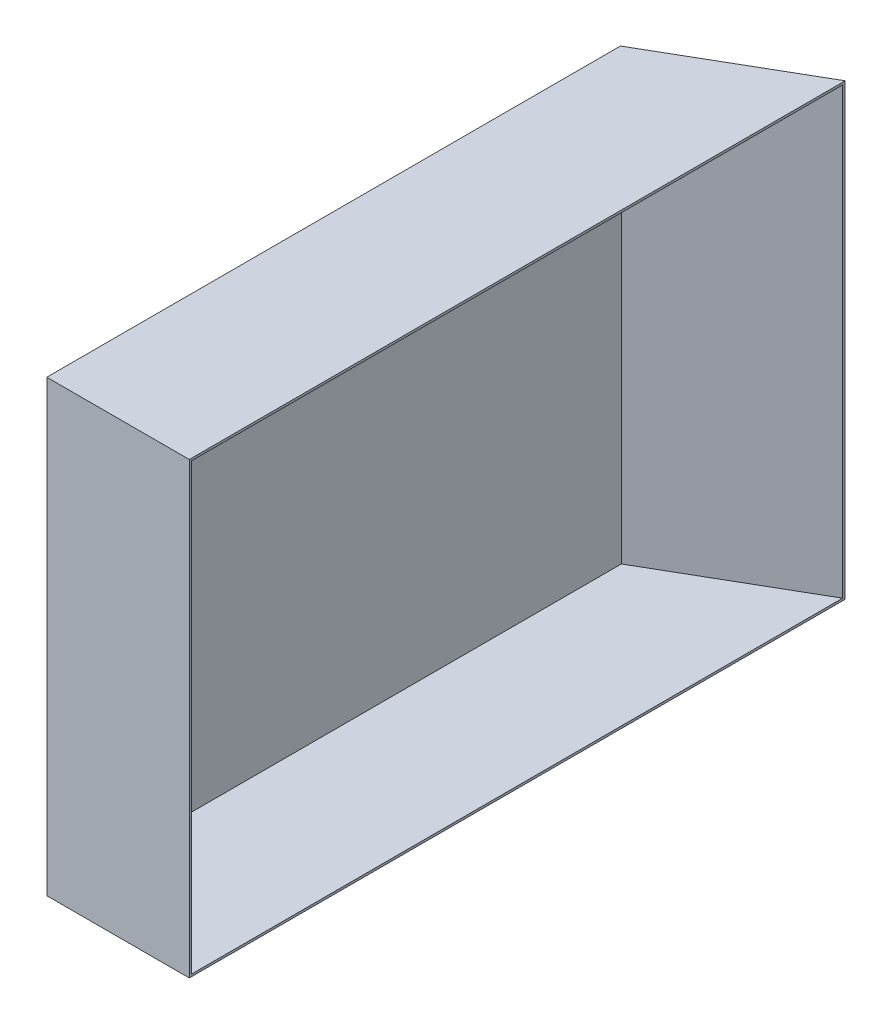
ISO-10303-21;
HEADER;
FILE_DESCRIPTION(('STEP AP214'),'2;1');
FILE_NAME('part.step','',(''),(''),'','','');
FILE_SCHEMA(('AUTOMOTIVE_DESIGN { 1 0 10303 214 1 1 1 1 }'));
ENDSEC;
DATA;
#1=APPLICATION_CONTEXT('core data for automotive mechanical design processes');
#2=APPLICATION_PROTOCOL_DEFINITION('international standard','automotive_design',2000,#1);
#3=PRODUCT_CONTEXT('',#1,'mechanical');
#4=PRODUCT('Part','Part','',(#3));
#5=PRODUCT_RELATED_PRODUCT_CATEGORY('part','',(#4));
#6=PRODUCT_DEFINITION_FORMATION('','',#4);
#7=PRODUCT_DEFINITION_CONTEXT('part definition',#1,'design');
#8=PRODUCT_DEFINITION('design','',#6,#7);
#9=PRODUCT_DEFINITION_SHAPE('','',#8);
#10=(LENGTH_UNIT() NAMED_UNIT(*) SI_UNIT(.MILLI.,.METRE.));
#11=(NAMED_UNIT(*) PLANE_ANGLE_UNIT() SI_UNIT($,.RADIAN.));
#12=(NAMED_UNIT(*) SI_UNIT($,.STERADIAN.) SOLID_ANGLE_UNIT());
#13=UNCERTAINTY_MEASURE_WITH_UNIT(LENGTH_MEASURE(1.E-05),#10,'distance_accuracy_value','');
#14=(GEOMETRIC_REPRESENTATION_CONTEXT(3) GLOBAL_UNCERTAINTY_ASSIGNED_CONTEXT((#13)) GLOBAL_UNIT_ASSIGNED_CONTEXT((#10,
#11,#12)) REPRESENTATION_CONTEXT('',''));
#15=CARTESIAN_POINT('',(0.,0.,0.));
#16=DIRECTION('',(0.,0.,1.));
#17=DIRECTION('',(1.,0.,0.));
#18=AXIS2_PLACEMENT_3D('',#15,#16,#17);
#19=CARTESIAN_POINT('',(196.776289052867,-246.000000000025,-227.031674572562));
#20=DIRECTION('',(1.,0.,0.));
#21=DIRECTION('',(0.,0.,-1.));
#22=AXIS2_PLACEMENT_3D('',#19,#20,#21);
#23=PLANE('',#22);
#24=DIRECTION('',(0.,0.,-1.));
#25=VECTOR('',#24,1.);
#26=CARTESIAN_POINT('',(196.776289052867,253.999999999975,-227.031674572546));
#27=LINE('',#26,#25);
#28=CARTESIAN_POINT('',(196.776289052867,253.999999999952,503.309343176868));
#29=VERTEX_POINT('',#28);
#30=CARTESIAN_POINT('',(196.776289052867,253.999999999975,-227.031674572546));
#31=VERTEX_POINT('',#30);
#32=EDGE_CURVE('E144',#29,#31,#27,.T.);
#33=ORIENTED_EDGE('',*,*,#32,.F.);
#34=DIRECTION('',(0.,1.,0.));
#35=VECTOR('',#34,1.);
#36=CARTESIAN_POINT('',(196.776289052867,-246.000000000048,503.309343176853));
#37=LINE('',#36,#35);
#38=CARTESIAN_POINT('',(196.776289052867,-246.000000000048,503.309343176853));
#39=VERTEX_POINT('',#38);
#40=EDGE_CURVE('E11',#39,#29,#37,.T.);
#41=ORIENTED_EDGE('',*,*,#40,.F.);
#42=DIRECTION('',(0.,0.,-1.));
#43=VECTOR('',#42,1.);
#44=CARTESIAN_POINT('',(196.776289052867,-246.000000000025,-227.031674572562));
#45=LINE('',#44,#43);
#46=CARTESIAN_POINT('',(196.776289052867,-246.000000000025,-227.031674572562));
#47=VERTEX_POINT('',#46);
#48=EDGE_CURVE('E148',#39,#47,#45,.T.);
#49=ORIENTED_EDGE('',*,*,#48,.T.);
#50=DIRECTION('',(0.,1.,0.));
#51=VECTOR('',#50,1.);
#52=CARTESIAN_POINT('',(196.776289052867,-246.000000000025,-227.031674572562));
#53=LINE('',#52,#51);
#54=EDGE_CURVE('E40',#47,#31,#53,.T.);
#55=ORIENTED_EDGE('',*,*,#54,.T.);
#56=EDGE_LOOP('',(#33,#41,#49,#55));
#57=FACE_BOUND('',#56,.T.);
#58=DIRECTION('',(0.,1.,0.));
#59=VECTOR('',#58,1.);
#60=CARTESIAN_POINT('',(196.776289052867,-246.000000000048,500.769343176853));
#61=LINE('',#60,#59);
#62=CARTESIAN_POINT('',(196.776289052867,-243.460000000048,500.769343176853));
#63=VERTEX_POINT('',#62);
#64=CARTESIAN_POINT('',(196.776289052867,251.459999999952,500.769343176868));
#65=VERTEX_POINT('',#64);
#66=EDGE_CURVE('E121',#63,#65,#61,.T.);
#67=ORIENTED_EDGE('',*,*,#66,.T.);
#68=DIRECTION('',(0.,0.,-1.));
#69=VECTOR('',#68,1.);
#70=CARTESIAN_POINT('',(196.776289052867,251.459999999975,-227.031674572547));
#71=LINE('',#70,#69);
#72=CARTESIAN_POINT('',(196.776289052867,251.459999999974,-224.098735205063));
#73=VERTEX_POINT('',#72);
#74=EDGE_CURVE('E141',#65,#73,#71,.T.);
#75=ORIENTED_EDGE('',*,*,#74,.T.);
#76=DIRECTION('',(0.,1.,0.));
#77=VECTOR('',#76,1.);
#78=CARTESIAN_POINT('',(196.776289052867,-246.000000000026,-224.098735205078));
#79=LINE('',#78,#77);
#80=CARTESIAN_POINT('',(196.776289052867,-243.460000000026,-224.098735205078));
#81=VERTEX_POINT('',#80);
#82=EDGE_CURVE('E130',#81,#73,#79,.T.);
#83=ORIENTED_EDGE('',*,*,#82,.F.);
#84=DIRECTION('',(0.,0.,-1.));
#85=VECTOR('',#84,1.);
#86=CARTESIAN_POINT('',(196.776289052867,-243.460000000026,-227.031674572562));
#87=LINE('',#86,#85);
#88=EDGE_CURVE('E53',#63,#81,#87,.T.);
#89=ORIENTED_EDGE('',*,*,#88,.F.);
#90=EDGE_LOOP('',(#67,#75,#83,#89));
#91=FACE_BOUND('',#90,.T.);
#92=ADVANCED_FACE('F37',(#57,#91),#23,.T.);
#93=CARTESIAN_POINT('',(196.776289052867,-246.000000000048,503.309343176853));
#94=DIRECTION('',(0.,0.,1.));
#95=DIRECTION('',(0.,-1.,0.));
#96=AXIS2_PLACEMENT_3D('',#93,#94,#95);
#97=PLANE('',#96);
#98=DIRECTION('',(1.,0.,0.));
#99=VECTOR('',#98,1.);
#100=CARTESIAN_POINT('',(196.776289052867,253.999999999952,503.309343176868));
#101=LINE('',#100,#99);
#102=CARTESIAN_POINT('',(38.1000000000001,253.999999999952,503.309343176868));
#103=VERTEX_POINT('',#102);
#104=EDGE_CURVE('E151',#103,#29,#101,.T.);
#105=ORIENTED_EDGE('',*,*,#104,.F.);
#106=DIRECTION('',(0.,1.,0.));
#107=VECTOR('',#106,1.);
#108=CARTESIAN_POINT('',(38.1000000000001,-246.000000000048,503.309343176853));
#109=LINE('',#108,#107);
#110=CARTESIAN_POINT('',(38.1000000000001,-246.000000000048,503.309343176853));
#111=VERTEX_POINT('',#110);
#112=EDGE_CURVE('E45',#111,#103,#109,.T.);
#113=ORIENTED_EDGE('',*,*,#112,.F.);
#114=DIRECTION('',(1.,0.,0.));
#115=VECTOR('',#114,1.);
#116=CARTESIAN_POINT('',(196.776289052867,-246.000000000048,503.309343176853));
#117=LINE('',#116,#115);
#118=EDGE_CURVE('E156',#111,#39,#117,.T.);
#119=ORIENTED_EDGE('',*,*,#118,.T.);
#120=ORIENTED_EDGE('',*,*,#40,.T.);
#121=EDGE_LOOP('',(#105,#113,#119,#120));
#122=FACE_BOUND('',#121,.T.);
#123=ADVANCED_FACE('F174',(#122),#97,.T.);
#124=CARTESIAN_POINT('',(38.1,-246.000000000028,-135.419876373879));
#125=DIRECTION('',(-1.,0.,0.));
#126=DIRECTION('',(0.,0.,1.));
#127=AXIS2_PLACEMENT_3D('',#124,#125,#126);
#128=PLANE('',#127);
#129=DIRECTION('',(0.,0.,1.));
#130=VECTOR('',#129,1.);
#131=CARTESIAN_POINT('',(38.1,253.999999999972,-135.419876373864));
#132=LINE('',#131,#130);
#133=CARTESIAN_POINT('',(38.1,253.999999999972,-135.419876373864));
#134=VERTEX_POINT('',#133);
#135=EDGE_CURVE('E163',#134,#103,#132,.T.);
#136=ORIENTED_EDGE('',*,*,#135,.F.);
#137=DIRECTION('',(0.,1.,0.));
#138=VECTOR('',#137,1.);
#139=CARTESIAN_POINT('',(38.1,-246.000000000028,-135.419876373879));
#140=LINE('',#139,#138);
#141=CARTESIAN_POINT('',(38.1,-246.000000000028,-135.419876373879));
#142=VERTEX_POINT('',#141);
#143=EDGE_CURVE('E168',#142,#134,#140,.T.);
#144=ORIENTED_EDGE('',*,*,#143,.F.);
#145=DIRECTION('',(0.,0.,1.));
#146=VECTOR('',#145,1.);
#147=CARTESIAN_POINT('',(38.1,-246.000000000028,-135.419876373879));
#148=LINE('',#147,#146);
#149=EDGE_CURVE('E153',#142,#111,#148,.T.);
#150=ORIENTED_EDGE('',*,*,#149,.T.);
#151=ORIENTED_EDGE('',*,*,#112,.T.);
#152=EDGE_LOOP('',(#136,#144,#150,#151));
#153=FACE_BOUND('',#152,.T.);
#154=ADVANCED_FACE('F178',(#153),#128,.T.);
#155=CARTESIAN_POINT('',(196.776289052867,-246.000000000025,-227.031674572562));
#156=DIRECTION('',(-0.499999999999998,0.,-0.86602540378444));
#157=DIRECTION('',(-0.86602540378444,0.,0.499999999999998));
#158=AXIS2_PLACEMENT_3D('',#155,#156,#157);
#159=PLANE('',#158);
#160=DIRECTION('',(-0.86602540378444,0.,0.499999999999998));
#161=VECTOR('',#160,1.);
#162=CARTESIAN_POINT('',(196.776289052867,253.999999999975,-227.031674572546));
#163=LINE('',#162,#161);
#164=EDGE_CURVE('E160',#31,#134,#163,.T.);
#165=ORIENTED_EDGE('',*,*,#164,.F.);
#166=ORIENTED_EDGE('',*,*,#54,.F.);
#167=DIRECTION('',(-0.86602540378444,0.,0.499999999999998));
#168=VECTOR('',#167,1.);
#169=CARTESIAN_POINT('',(196.776289052867,-246.000000000025,-227.031674572562));
#170=LINE('',#169,#168);
#171=EDGE_CURVE('E150',#47,#142,#170,.T.);
#172=ORIENTED_EDGE('',*,*,#171,.T.);
#173=ORIENTED_EDGE('',*,*,#143,.T.);
#174=EDGE_LOOP('',(#165,#166,#172,#173));
#175=FACE_BOUND('',#174,.T.);
#176=ADVANCED_FACE('F171',(#175),#159,.T.);
#177=CARTESIAN_POINT('',(0.,-246.000000000032,-7.49617709115698E-12));
#178=DIRECTION('',(0.,-1.,0.));
#179=DIRECTION('',(0.,0.,-1.));
#180=AXIS2_PLACEMENT_3D('',#177,#178,#179);
#181=PLANE('',#180);
#182=ORIENTED_EDGE('',*,*,#48,.F.);
#183=ORIENTED_EDGE('',*,*,#118,.F.);
#184=ORIENTED_EDGE('',*,*,#149,.F.);
#185=ORIENTED_EDGE('',*,*,#171,.F.);
#186=EDGE_LOOP('',(#182,#183,#184,#185));
#187=FACE_BOUND('',#186,.T.);
#188=ADVANCED_FACE('F180',(#187),#181,.T.);
#189=CARTESIAN_POINT('',(0.,253.999999999968,7.74163392182329E-12));
#190=DIRECTION('',(0.,-1.,0.));
#191=DIRECTION('',(0.,0.,-1.));
#192=AXIS2_PLACEMENT_3D('',#189,#190,#191);
#193=PLANE('',#192);
#194=ORIENTED_EDGE('',*,*,#32,.T.);
#195=ORIENTED_EDGE('',*,*,#164,.T.);
#196=ORIENTED_EDGE('',*,*,#135,.T.);
#197=ORIENTED_EDGE('',*,*,#104,.T.);
#198=EDGE_LOOP('',(#194,#195,#196,#197));
#199=FACE_BOUND('',#198,.T.);
#200=ADVANCED_FACE('F173',(#199),#193,.F.);
#201=CARTESIAN_POINT('',(196.776289052867,-246.000000000048,500.769343176853));
#202=DIRECTION('',(0.,0.,1.));
#203=DIRECTION('',(0.,-1.,0.));
#204=AXIS2_PLACEMENT_3D('',#201,#202,#203);
#205=PLANE('',#204);
#206=DIRECTION('',(1.,0.,0.));
#207=VECTOR('',#206,1.);
#208=CARTESIAN_POINT('',(196.776289052867,251.459999999952,500.769343176868));
#209=LINE('',#208,#207);
#210=CARTESIAN_POINT('',(40.6400000000001,251.459999999952,500.769343176868));
#211=VERTEX_POINT('',#210);
#212=EDGE_CURVE('E136',#211,#65,#209,.T.);
#213=ORIENTED_EDGE('',*,*,#212,.T.);
#214=ORIENTED_EDGE('',*,*,#66,.F.);
#215=DIRECTION('',(1.,0.,0.));
#216=VECTOR('',#215,1.);
#217=CARTESIAN_POINT('',(196.776289052867,-243.460000000048,500.769343176853));
#218=LINE('',#217,#216);
#219=CARTESIAN_POINT('',(40.6400000000001,-243.460000000048,500.769343176853));
#220=VERTEX_POINT('',#219);
#221=EDGE_CURVE('E125',#220,#63,#218,.T.);
#222=ORIENTED_EDGE('',*,*,#221,.F.);
#223=DIRECTION('',(0.,1.,0.));
#224=VECTOR('',#223,1.);
#225=CARTESIAN_POINT('',(40.6400000000001,-246.000000000048,500.769343176853));
#226=LINE('',#225,#224);
#227=EDGE_CURVE('E111',#220,#211,#226,.T.);
#228=ORIENTED_EDGE('',*,*,#227,.T.);
#229=EDGE_LOOP('',(#213,#214,#222,#228));
#230=FACE_BOUND('',#229,.T.);
#231=ADVANCED_FACE('F128',(#230),#205,.F.);
#232=CARTESIAN_POINT('',(40.64,-246.000000000028,-135.419876373879));
#233=DIRECTION('',(-1.,0.,0.));
#234=DIRECTION('',(0.,0.,1.));
#235=AXIS2_PLACEMENT_3D('',#232,#233,#234);
#236=PLANE('',#235);
#237=DIRECTION('',(0.,0.,1.));
#238=VECTOR('',#237,1.);
#239=CARTESIAN_POINT('',(40.64,251.459999999972,-135.419876373864));
#240=LINE('',#239,#238);
#241=CARTESIAN_POINT('',(40.64,251.459999999972,-133.953406690122));
#242=VERTEX_POINT('',#241);
#243=EDGE_CURVE('E116',#242,#211,#240,.T.);
#244=ORIENTED_EDGE('',*,*,#243,.T.);
#245=ORIENTED_EDGE('',*,*,#227,.F.);
#246=DIRECTION('',(0.,0.,1.));
#247=VECTOR('',#246,1.);
#248=CARTESIAN_POINT('',(40.64,-243.460000000028,-135.419876373879));
#249=LINE('',#248,#247);
#250=CARTESIAN_POINT('',(40.64,-243.460000000028,-133.953406690137));
#251=VERTEX_POINT('',#250);
#252=EDGE_CURVE('E114',#251,#220,#249,.T.);
#253=ORIENTED_EDGE('',*,*,#252,.F.);
#254=DIRECTION('',(0.,1.,0.));
#255=VECTOR('',#254,1.);
#256=CARTESIAN_POINT('',(40.64,-246.000000000028,-133.953406690137));
#257=LINE('',#256,#255);
#258=EDGE_CURVE('E122',#251,#242,#257,.T.);
#259=ORIENTED_EDGE('',*,*,#258,.T.);
#260=EDGE_LOOP('',(#244,#245,#253,#259));
#261=FACE_BOUND('',#260,.T.);
#262=ADVANCED_FACE('F113',(#261),#236,.F.);
#263=CARTESIAN_POINT('',(198.046289052867,-246.000000000026,-224.831970046949));
#264=DIRECTION('',(-0.499999999999998,0.,-0.86602540378444));
#265=DIRECTION('',(-0.86602540378444,0.,0.499999999999998));
#266=AXIS2_PLACEMENT_3D('',#263,#264,#265);
#267=PLANE('',#266);
#268=DIRECTION('',(-0.86602540378444,0.,0.499999999999998));
#269=VECTOR('',#268,1.);
#270=CARTESIAN_POINT('',(198.046289052867,251.459999999974,-224.831970046934));
#271=LINE('',#270,#269);
#272=EDGE_CURVE('E137',#73,#242,#271,.T.);
#273=ORIENTED_EDGE('',*,*,#272,.T.);
#274=ORIENTED_EDGE('',*,*,#258,.F.);
#275=DIRECTION('',(-0.86602540378444,0.,0.499999999999998));
#276=VECTOR('',#275,1.);
#277=CARTESIAN_POINT('',(198.046289052867,-243.460000000026,-224.831970046949));
#278=LINE('',#277,#276);
#279=EDGE_CURVE('E126',#81,#251,#278,.T.);
#280=ORIENTED_EDGE('',*,*,#279,.F.);
#281=ORIENTED_EDGE('',*,*,#82,.T.);
#282=EDGE_LOOP('',(#273,#274,#280,#281));
#283=FACE_BOUND('',#282,.T.);
#284=ADVANCED_FACE('F235',(#283),#267,.F.);
#285=CARTESIAN_POINT('',(0.,-243.460000000032,-7.41876075193874E-12));
#286=DIRECTION('',(0.,-1.,0.));
#287=DIRECTION('',(0.,0.,-1.));
#288=AXIS2_PLACEMENT_3D('',#285,#286,#287);
#289=PLANE('',#288);
#290=ORIENTED_EDGE('',*,*,#88,.T.);
#291=ORIENTED_EDGE('',*,*,#279,.T.);
#292=ORIENTED_EDGE('',*,*,#252,.T.);
#293=ORIENTED_EDGE('',*,*,#221,.T.);
#294=EDGE_LOOP('',(#290,#291,#292,#293));
#295=FACE_BOUND('',#294,.T.);
#296=ADVANCED_FACE('F124',(#295),#289,.F.);
#297=CARTESIAN_POINT('',(0.,251.459999999968,7.66421758260505E-12));
#298=DIRECTION('',(0.,-1.,0.));
#299=DIRECTION('',(0.,0.,-1.));
#300=AXIS2_PLACEMENT_3D('',#297,#298,#299);
#301=PLANE('',#300);
#302=ORIENTED_EDGE('',*,*,#74,.F.);
#303=ORIENTED_EDGE('',*,*,#212,.F.);
#304=ORIENTED_EDGE('',*,*,#243,.F.);
#305=ORIENTED_EDGE('',*,*,#272,.F.);
#306=EDGE_LOOP('',(#302,#303,#304,#305));
#307=FACE_BOUND('',#306,.T.);
#308=ADVANCED_FACE('F253',(#307),#301,.T.);
#309=CLOSED_SHELL('',(#92,#123,#154,#176,#188,#200,#231,#262,#284,#296,#308));
#310=MANIFOLD_SOLID_BREP('B2',#309);
#311=ADVANCED_BREP_SHAPE_REPRESENTATION('',(#18,#310),#14);
#312=SHAPE_DEFINITION_REPRESENTATION(#9,#311);
ENDSEC;
END-ISO-10303-21;
